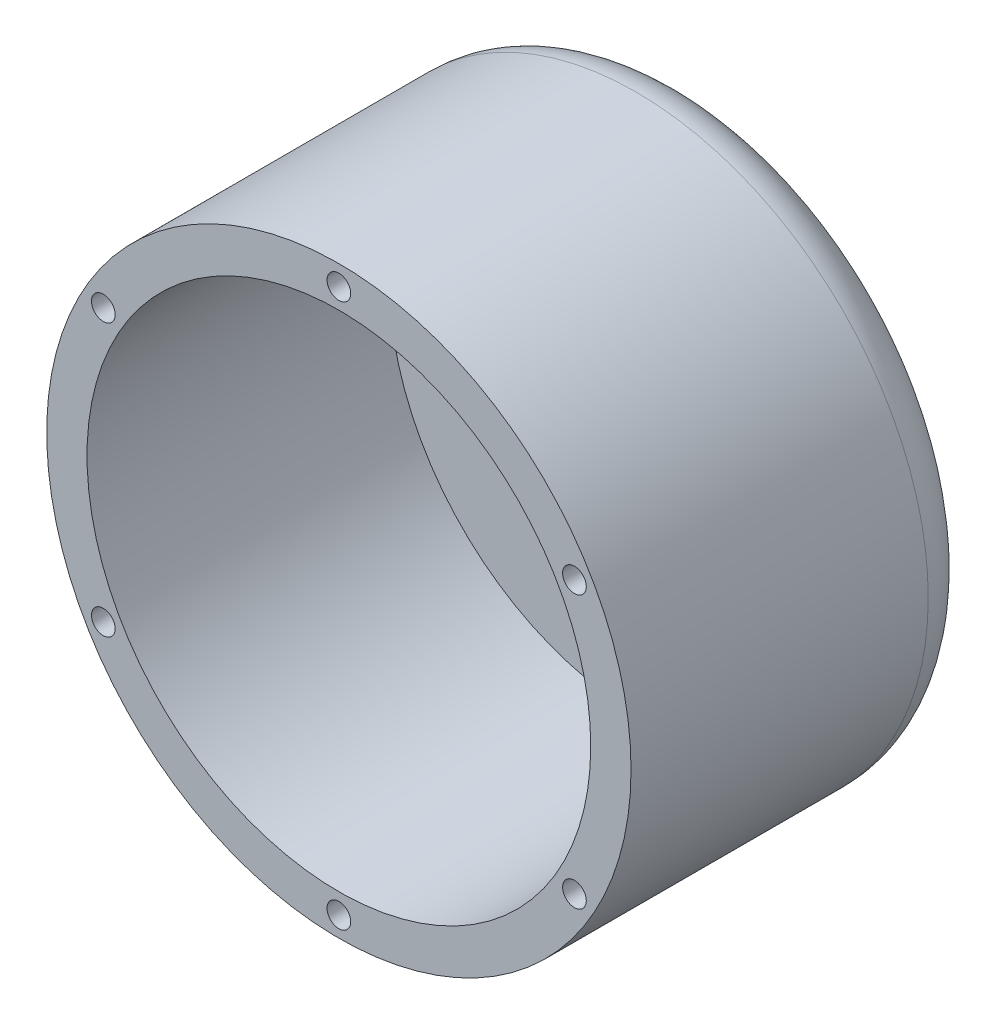
ISO-10303-21;
HEADER;
FILE_DESCRIPTION(('STEP AP214'),'2;1');
FILE_NAME('part.step','',(''),(''),'','','');
FILE_SCHEMA(('AUTOMOTIVE_DESIGN { 1 0 10303 214 1 1 1 1 }'));
ENDSEC;
DATA;
#1=APPLICATION_CONTEXT('core data for automotive mechanical design processes');
#2=APPLICATION_PROTOCOL_DEFINITION('international standard','automotive_design',2000,#1);
#3=PRODUCT_CONTEXT('',#1,'mechanical');
#4=PRODUCT('Part','Part','',(#3));
#5=PRODUCT_RELATED_PRODUCT_CATEGORY('part','',(#4));
#6=PRODUCT_DEFINITION_FORMATION('','',#4);
#7=PRODUCT_DEFINITION_CONTEXT('part definition',#1,'design');
#8=PRODUCT_DEFINITION('design','',#6,#7);
#9=PRODUCT_DEFINITION_SHAPE('','',#8);
#10=(LENGTH_UNIT() NAMED_UNIT(*) SI_UNIT(.MILLI.,.METRE.));
#11=(NAMED_UNIT(*) PLANE_ANGLE_UNIT() SI_UNIT($,.RADIAN.));
#12=(NAMED_UNIT(*) SI_UNIT($,.STERADIAN.) SOLID_ANGLE_UNIT());
#13=UNCERTAINTY_MEASURE_WITH_UNIT(LENGTH_MEASURE(1.E-05),#10,'distance_accuracy_value','');
#14=(GEOMETRIC_REPRESENTATION_CONTEXT(3) GLOBAL_UNCERTAINTY_ASSIGNED_CONTEXT((#13)) GLOBAL_UNIT_ASSIGNED_CONTEXT((#10,
#11,#12)) REPRESENTATION_CONTEXT('',''));
#15=CARTESIAN_POINT('',(0.,0.,0.));
#16=DIRECTION('',(0.,0.,1.));
#17=DIRECTION('',(1.,0.,0.));
#18=AXIS2_PLACEMENT_3D('',#15,#16,#17);
#19=CARTESIAN_POINT('',(0.,0.,-59.9999999999999));
#20=DIRECTION('',(0.,0.,-1.));
#21=DIRECTION('',(-1.,0.,0.));
#22=AXIS2_PLACEMENT_3D('',#19,#20,#21);
#23=PLANE('',#22);
#24=CARTESIAN_POINT('',(-2.05814939933146E-13,0.,-59.9999999999998));
#25=DIRECTION('',(0.,0.,1.));
#26=DIRECTION('',(1.,0.,0.));
#27=AXIS2_PLACEMENT_3D('',#24,#25,#26);
#28=CIRCLE('',#27,50.0000000000002);
#29=CARTESIAN_POINT('',(50.,0.,-60.));
#30=VERTEX_POINT('',#29);
#31=EDGE_CURVE('E167',#30,#30,#28,.T.);
#32=ORIENTED_EDGE('',*,*,#31,.T.);
#33=EDGE_LOOP('',(#32));
#34=FACE_BOUND('',#33,.T.);
#35=CARTESIAN_POINT('',(-15.0000000000002,5.,-59.9999999999999));
#36=DIRECTION('',(0.,0.,-1.));
#37=DIRECTION('',(-1.,0.,0.));
#38=AXIS2_PLACEMENT_3D('',#35,#36,#37);
#39=CIRCLE('',#38,1.5);
#40=CARTESIAN_POINT('',(-16.5000000000002,5.,-59.9999999999999));
#41=VERTEX_POINT('',#40);
#42=EDGE_CURVE('E122',#41,#41,#39,.F.);
#43=ORIENTED_EDGE('',*,*,#42,.F.);
#44=EDGE_LOOP('',(#43));
#45=FACE_BOUND('',#44,.T.);
#46=CARTESIAN_POINT('',(32.9999999999998,5.,-60.));
#47=DIRECTION('',(0.,0.,-1.));
#48=DIRECTION('',(-1.,0.,0.));
#49=AXIS2_PLACEMENT_3D('',#46,#47,#48);
#50=CIRCLE('',#49,1.5);
#51=CARTESIAN_POINT('',(31.4999999999998,5.,-60.));
#52=VERTEX_POINT('',#51);
#53=EDGE_CURVE('E102',#52,#52,#50,.F.);
#54=ORIENTED_EDGE('',*,*,#53,.F.);
#55=EDGE_LOOP('',(#54));
#56=FACE_BOUND('',#55,.T.);
#57=CARTESIAN_POINT('',(32.9999999999998,-5.00000000000001,-60.));
#58=DIRECTION('',(0.,0.,-1.));
#59=DIRECTION('',(-1.,0.,0.));
#60=AXIS2_PLACEMENT_3D('',#57,#58,#59);
#61=CIRCLE('',#60,1.5);
#62=CARTESIAN_POINT('',(31.4999999999998,-5.00000000000001,-60.));
#63=VERTEX_POINT('',#62);
#64=EDGE_CURVE('E114',#63,#63,#61,.F.);
#65=ORIENTED_EDGE('',*,*,#64,.F.);
#66=EDGE_LOOP('',(#65));
#67=FACE_BOUND('',#66,.T.);
#68=CARTESIAN_POINT('',(-15.0000000000002,-5.,-59.9999999999999));
#69=DIRECTION('',(0.,0.,-1.));
#70=DIRECTION('',(-1.,0.,0.));
#71=AXIS2_PLACEMENT_3D('',#68,#69,#70);
#72=CIRCLE('',#71,1.5);
#73=CARTESIAN_POINT('',(-16.5000000000002,-5.,-59.9999999999999));
#74=VERTEX_POINT('',#73);
#75=EDGE_CURVE('E106',#74,#74,#72,.F.);
#76=ORIENTED_EDGE('',*,*,#75,.F.);
#77=EDGE_LOOP('',(#76));
#78=FACE_BOUND('',#77,.T.);
#79=DIRECTION('',(1.,0.,0.));
#80=VECTOR('',#79,1.);
#81=CARTESIAN_POINT('',(29.4999999999998,-10.,-60.));
#82=LINE('',#81,#80);
#83=CARTESIAN_POINT('',(-11.5000000000002,-10.,-60.));
#84=VERTEX_POINT('',#83);
#85=CARTESIAN_POINT('',(29.5,-10.,-60.));
#86=VERTEX_POINT('',#85);
#87=EDGE_CURVE('E88',#84,#86,#82,.T.);
#88=ORIENTED_EDGE('',*,*,#87,.F.);
#89=DIRECTION('',(0.,-1.,0.));
#90=VECTOR('',#89,1.);
#91=CARTESIAN_POINT('',(-11.5000000000002,10.,-59.9999999999999));
#92=LINE('',#91,#90);
#93=CARTESIAN_POINT('',(-11.5000000000002,10.,-59.9999999999999));
#94=VERTEX_POINT('',#93);
#95=EDGE_CURVE('E100',#94,#84,#92,.T.);
#96=ORIENTED_EDGE('',*,*,#95,.F.);
#97=DIRECTION('',(-1.,0.,0.));
#98=VECTOR('',#97,1.);
#99=CARTESIAN_POINT('',(29.4999999999998,10.,-60.));
#100=LINE('',#99,#98);
#101=CARTESIAN_POINT('',(29.4999999999998,10.,-60.));
#102=VERTEX_POINT('',#101);
#103=EDGE_CURVE('E58',#102,#94,#100,.T.);
#104=ORIENTED_EDGE('',*,*,#103,.F.);
#105=DIRECTION('',(0.,1.,0.));
#106=VECTOR('',#105,1.);
#107=CARTESIAN_POINT('',(29.4999999999998,10.,-60.));
#108=LINE('',#107,#106);
#109=EDGE_CURVE('E91',#86,#102,#108,.T.);
#110=ORIENTED_EDGE('',*,*,#109,.F.);
#111=EDGE_LOOP('',(#88,#96,#104,#110));
#112=FACE_BOUND('',#111,.T.);
#113=ADVANCED_FACE('F43',(#34,#45,#56,#67,#78,#112),#23,.F.);
#114=CARTESIAN_POINT('',(3.43024899888577E-12,0.,1000.));
#115=DIRECTION('',(0.,0.,1.));
#116=DIRECTION('',(1.,0.,0.));
#117=AXIS2_PLACEMENT_3D('',#114,#115,#116);
#118=CYLINDRICAL_SURFACE('',#117,50.0000000000001);
#119=ORIENTED_EDGE('',*,*,#31,.F.);
#120=EDGE_LOOP('',(#119));
#121=FACE_BOUND('',#120,.T.);
#122=CARTESIAN_POINT('',(0.,0.,2.22044604925031E-13));
#123=DIRECTION('',(0.,0.,1.));
#124=DIRECTION('',(1.,0.,0.));
#125=AXIS2_PLACEMENT_3D('',#122,#123,#124);
#126=CIRCLE('',#125,50.);
#127=CARTESIAN_POINT('',(50.,0.,0.));
#128=VERTEX_POINT('',#127);
#129=EDGE_CURVE('E164',#128,#128,#126,.T.);
#130=ORIENTED_EDGE('',*,*,#129,.T.);
#131=EDGE_LOOP('',(#130));
#132=FACE_BOUND('',#131,.T.);
#133=ADVANCED_FACE('F187',(#121,#132),#118,.F.);
#134=CARTESIAN_POINT('',(0.,0.,1.78728232904918E-13));
#135=DIRECTION('',(0.,0.,-1.));
#136=DIRECTION('',(-1.,0.,0.));
#137=AXIS2_PLACEMENT_3D('',#134,#135,#136);
#138=PLANE('',#137);
#139=CARTESIAN_POINT('',(0.,54.,0.));
#140=DIRECTION('',(0.,0.,1.));
#141=DIRECTION('',(1.,0.,0.));
#142=AXIS2_PLACEMENT_3D('',#139,#140,#141);
#143=CIRCLE('',#142,2.35);
#144=CARTESIAN_POINT('',(2.35,54.,0.));
#145=VERTEX_POINT('',#144);
#146=EDGE_CURVE('E130',#145,#145,#143,.T.);
#147=ORIENTED_EDGE('',*,*,#146,.F.);
#148=EDGE_LOOP('',(#147));
#149=FACE_BOUND('',#148,.T.);
#150=CARTESIAN_POINT('',(-46.7653718043594,27.0000000000005,0.));
#151=DIRECTION('',(0.,0.,1.));
#152=DIRECTION('',(1.,0.,0.));
#153=AXIS2_PLACEMENT_3D('',#150,#151,#152);
#154=CIRCLE('',#153,2.35);
#155=CARTESIAN_POINT('',(-44.4153718043594,27.0000000000005,0.));
#156=VERTEX_POINT('',#155);
#157=EDGE_CURVE('E134',#156,#156,#154,.T.);
#158=ORIENTED_EDGE('',*,*,#157,.F.);
#159=EDGE_LOOP('',(#158));
#160=FACE_BOUND('',#159,.T.);
#161=CARTESIAN_POINT('',(-46.7653718043599,-26.9999999999996,0.));
#162=DIRECTION('',(0.,0.,1.));
#163=DIRECTION('',(1.,0.,0.));
#164=AXIS2_PLACEMENT_3D('',#161,#162,#163);
#165=CIRCLE('',#164,2.35);
#166=CARTESIAN_POINT('',(-44.4153718043599,-26.9999999999996,0.));
#167=VERTEX_POINT('',#166);
#168=EDGE_CURVE('E157',#167,#167,#165,.T.);
#169=ORIENTED_EDGE('',*,*,#168,.F.);
#170=EDGE_LOOP('',(#169));
#171=FACE_BOUND('',#170,.T.);
#172=CARTESIAN_POINT('',(-3.78189438528707E-13,-54.,0.));
#173=DIRECTION('',(0.,0.,1.));
#174=DIRECTION('',(1.,0.,0.));
#175=AXIS2_PLACEMENT_3D('',#172,#173,#174);
#176=CIRCLE('',#175,2.35);
#177=CARTESIAN_POINT('',(2.34999999999962,-54.,0.));
#178=VERTEX_POINT('',#177);
#179=EDGE_CURVE('E151',#178,#178,#176,.T.);
#180=ORIENTED_EDGE('',*,*,#179,.F.);
#181=EDGE_LOOP('',(#180));
#182=FACE_BOUND('',#181,.T.);
#183=CARTESIAN_POINT('',(46.7653718043596,-27.0000000000002,0.));
#184=DIRECTION('',(0.,0.,1.));
#185=DIRECTION('',(1.,0.,0.));
#186=AXIS2_PLACEMENT_3D('',#183,#184,#185);
#187=CIRCLE('',#186,2.35);
#188=CARTESIAN_POINT('',(49.1153718043596,-27.0000000000002,0.));
#189=VERTEX_POINT('',#188);
#190=EDGE_CURVE('E145',#189,#189,#187,.T.);
#191=ORIENTED_EDGE('',*,*,#190,.F.);
#192=EDGE_LOOP('',(#191));
#193=FACE_BOUND('',#192,.T.);
#194=CARTESIAN_POINT('',(46.7653718043598,26.9999999999999,0.));
#195=DIRECTION('',(0.,0.,1.));
#196=DIRECTION('',(1.,0.,0.));
#197=AXIS2_PLACEMENT_3D('',#194,#195,#196);
#198=CIRCLE('',#197,2.35);
#199=CARTESIAN_POINT('',(49.1153718043598,26.9999999999999,0.));
#200=VERTEX_POINT('',#199);
#201=EDGE_CURVE('E133',#200,#200,#198,.T.);
#202=ORIENTED_EDGE('',*,*,#201,.F.);
#203=EDGE_LOOP('',(#202));
#204=FACE_BOUND('',#203,.T.);
#205=ORIENTED_EDGE('',*,*,#129,.F.);
#206=EDGE_LOOP('',(#205));
#207=FACE_BOUND('',#206,.T.);
#208=CARTESIAN_POINT('',(0.,0.,2.22044604925031E-13));
#209=DIRECTION('',(0.,0.,1.));
#210=DIRECTION('',(1.,0.,0.));
#211=AXIS2_PLACEMENT_3D('',#208,#209,#210);
#212=CIRCLE('',#211,58.);
#213=CARTESIAN_POINT('',(58.,0.,0.));
#214=VERTEX_POINT('',#213);
#215=EDGE_CURVE('E129',#214,#214,#212,.T.);
#216=ORIENTED_EDGE('',*,*,#215,.T.);
#217=EDGE_LOOP('',(#216));
#218=FACE_BOUND('',#217,.T.);
#219=ADVANCED_FACE('F194',(#149,#160,#171,#182,#193,#204,#207,#218),#138,.F.);
#220=CARTESIAN_POINT('',(3.43024899888577E-12,0.,1000.));
#221=DIRECTION('',(0.,0.,1.));
#222=DIRECTION('',(1.,0.,0.));
#223=AXIS2_PLACEMENT_3D('',#220,#221,#222);
#224=CYLINDRICAL_SURFACE('',#223,58.0000000000001);
#225=CARTESIAN_POINT('',(-2.0238469093426E-13,0.,-58.9999999999999));
#226=DIRECTION('',(0.,0.,-1.));
#227=DIRECTION('',(-1.,0.,0.));
#228=AXIS2_PLACEMENT_3D('',#225,#226,#227);
#229=CIRCLE('',#228,58.0000000000001);
#230=CARTESIAN_POINT('',(-58.0000000000003,0.,-58.9999999999997));
#231=VERTEX_POINT('',#230);
#232=EDGE_CURVE('E51',#231,#231,#229,.F.);
#233=ORIENTED_EDGE('',*,*,#232,.T.);
#234=EDGE_LOOP('',(#233));
#235=FACE_BOUND('',#234,.T.);
#236=ORIENTED_EDGE('',*,*,#215,.F.);
#237=EDGE_LOOP('',(#236));
#238=FACE_BOUND('',#237,.T.);
#239=ADVANCED_FACE('F172',(#235,#238),#224,.T.);
#240=CARTESIAN_POINT('',(0.,0.,-68.9999999999999));
#241=DIRECTION('',(0.,0.,-1.));
#242=DIRECTION('',(-1.,0.,0.));
#243=AXIS2_PLACEMENT_3D('',#240,#241,#242);
#244=PLANE('',#243);
#245=CARTESIAN_POINT('',(-2.36687180923118E-13,0.,-68.9999999999999));
#246=DIRECTION('',(0.,0.,-1.));
#247=DIRECTION('',(-1.,0.,0.));
#248=AXIS2_PLACEMENT_3D('',#245,#246,#247);
#249=CIRCLE('',#248,48.0000000000001);
#250=CARTESIAN_POINT('',(-48.0000000000004,0.,-68.9999999999997));
#251=VERTEX_POINT('',#250);
#252=EDGE_CURVE('E11',#251,#251,#249,.T.);
#253=ORIENTED_EDGE('',*,*,#252,.T.);
#254=EDGE_LOOP('',(#253));
#255=FACE_BOUND('',#254,.T.);
#256=CARTESIAN_POINT('',(-15.0000000000002,-5.,-68.9999999999999));
#257=DIRECTION('',(0.,0.,-1.));
#258=DIRECTION('',(1.,0.,0.));
#259=AXIS2_PLACEMENT_3D('',#256,#257,#258);
#260=CIRCLE('',#259,1.5);
#261=CARTESIAN_POINT('',(-16.5000000000002,-5.,-68.9999999999999));
#262=VERTEX_POINT('',#261);
#263=EDGE_CURVE('E109',#262,#262,#260,.T.);
#264=ORIENTED_EDGE('',*,*,#263,.F.);
#265=EDGE_LOOP('',(#264));
#266=FACE_BOUND('',#265,.T.);
#267=CARTESIAN_POINT('',(32.9999999999998,-5.00000000000001,-69.));
#268=DIRECTION('',(0.,0.,-1.));
#269=DIRECTION('',(-1.,0.,0.));
#270=AXIS2_PLACEMENT_3D('',#267,#268,#269);
#271=CIRCLE('',#270,1.5);
#272=CARTESIAN_POINT('',(31.4999999999998,-5.00000000000001,-69.));
#273=VERTEX_POINT('',#272);
#274=EDGE_CURVE('E110',#273,#273,#271,.T.);
#275=ORIENTED_EDGE('',*,*,#274,.F.);
#276=EDGE_LOOP('',(#275));
#277=FACE_BOUND('',#276,.T.);
#278=CARTESIAN_POINT('',(32.9999999999998,5.,-69.));
#279=DIRECTION('',(0.,0.,-1.));
#280=DIRECTION('',(1.,0.,0.));
#281=AXIS2_PLACEMENT_3D('',#278,#279,#280);
#282=CIRCLE('',#281,1.5);
#283=CARTESIAN_POINT('',(31.4999999999998,5.,-69.));
#284=VERTEX_POINT('',#283);
#285=EDGE_CURVE('E117',#284,#284,#282,.T.);
#286=ORIENTED_EDGE('',*,*,#285,.F.);
#287=EDGE_LOOP('',(#286));
#288=FACE_BOUND('',#287,.T.);
#289=DIRECTION('',(0.,-1.,0.));
#290=VECTOR('',#289,1.);
#291=CARTESIAN_POINT('',(29.4999999999998,10.,-69.));
#292=LINE('',#291,#290);
#293=CARTESIAN_POINT('',(29.4999999999998,10.,-69.));
#294=VERTEX_POINT('',#293);
#295=CARTESIAN_POINT('',(29.4999999999998,-10.,-69.));
#296=VERTEX_POINT('',#295);
#297=EDGE_CURVE('E66',#294,#296,#292,.T.);
#298=ORIENTED_EDGE('',*,*,#297,.F.);
#299=DIRECTION('',(1.,0.,0.));
#300=VECTOR('',#299,1.);
#301=CARTESIAN_POINT('',(29.4999999999998,10.,-69.));
#302=LINE('',#301,#300);
#303=CARTESIAN_POINT('',(-11.5000000000002,10.,-68.9999999999999));
#304=VERTEX_POINT('',#303);
#305=EDGE_CURVE('E86',#304,#294,#302,.T.);
#306=ORIENTED_EDGE('',*,*,#305,.F.);
#307=DIRECTION('',(0.,1.,0.));
#308=VECTOR('',#307,1.);
#309=CARTESIAN_POINT('',(-11.5000000000002,10.,-68.9999999999999));
#310=LINE('',#309,#308);
#311=CARTESIAN_POINT('',(-11.5000000000002,-10.,-68.9999999999999));
#312=VERTEX_POINT('',#311);
#313=EDGE_CURVE('E292',#312,#304,#310,.T.);
#314=ORIENTED_EDGE('',*,*,#313,.F.);
#315=DIRECTION('',(-1.,0.,0.));
#316=VECTOR('',#315,1.);
#317=CARTESIAN_POINT('',(29.4999999999998,-10.,-69.));
#318=LINE('',#317,#316);
#319=EDGE_CURVE('E295',#296,#312,#318,.T.);
#320=ORIENTED_EDGE('',*,*,#319,.F.);
#321=EDGE_LOOP('',(#298,#306,#314,#320));
#322=FACE_BOUND('',#321,.T.);
#323=CARTESIAN_POINT('',(-15.0000000000002,5.,-68.9999999999999));
#324=DIRECTION('',(0.,0.,-1.));
#325=DIRECTION('',(-1.,0.,0.));
#326=AXIS2_PLACEMENT_3D('',#323,#324,#325);
#327=CIRCLE('',#326,1.5);
#328=CARTESIAN_POINT('',(-16.5000000000002,5.,-68.9999999999999));
#329=VERTEX_POINT('',#328);
#330=EDGE_CURVE('E113',#329,#329,#327,.T.);
#331=ORIENTED_EDGE('',*,*,#330,.F.);
#332=EDGE_LOOP('',(#331));
#333=FACE_BOUND('',#332,.T.);
#334=ADVANCED_FACE('F204',(#255,#266,#277,#288,#322,#333),#244,.T.);
#335=CARTESIAN_POINT('',(46.7653718043598,26.9999999999999,-6.));
#336=DIRECTION('',(0.,0.,1.));
#337=DIRECTION('',(1.,0.,0.));
#338=AXIS2_PLACEMENT_3D('',#335,#336,#337);
#339=CYLINDRICAL_SURFACE('',#338,2.35);
#340=CARTESIAN_POINT('',(46.7653718043598,26.9999999999999,-6.));
#341=DIRECTION('',(0.,0.,1.));
#342=DIRECTION('',(1.,0.,0.));
#343=AXIS2_PLACEMENT_3D('',#340,#341,#342);
#344=CIRCLE('',#343,2.35);
#345=CARTESIAN_POINT('',(49.1153718043598,26.9999999999999,-6.));
#346=VERTEX_POINT('',#345);
#347=EDGE_CURVE('E142',#346,#346,#344,.T.);
#348=ORIENTED_EDGE('',*,*,#347,.F.);
#349=EDGE_LOOP('',(#348));
#350=FACE_BOUND('',#349,.T.);
#351=ORIENTED_EDGE('',*,*,#201,.T.);
#352=EDGE_LOOP('',(#351));
#353=FACE_BOUND('',#352,.T.);
#354=ADVANCED_FACE('F206',(#350,#353),#339,.F.);
#355=CARTESIAN_POINT('',(46.7653718043598,26.9999999999999,-6.));
#356=DIRECTION('',(0.,0.,1.));
#357=DIRECTION('',(1.,0.,0.));
#358=AXIS2_PLACEMENT_3D('',#355,#356,#357);
#359=PLANE('',#358);
#360=ORIENTED_EDGE('',*,*,#347,.T.);
#361=EDGE_LOOP('',(#360));
#362=FACE_BOUND('',#361,.T.);
#363=ADVANCED_FACE('F232',(#362),#359,.T.);
#364=CARTESIAN_POINT('',(46.7653718043596,-27.0000000000002,-6.));
#365=DIRECTION('',(0.,0.,1.));
#366=DIRECTION('',(1.,0.,0.));
#367=AXIS2_PLACEMENT_3D('',#364,#365,#366);
#368=CYLINDRICAL_SURFACE('',#367,2.35);
#369=CARTESIAN_POINT('',(46.7653718043596,-27.0000000000002,-6.));
#370=DIRECTION('',(0.,0.,1.));
#371=DIRECTION('',(1.,0.,0.));
#372=AXIS2_PLACEMENT_3D('',#369,#370,#371);
#373=CIRCLE('',#372,2.35);
#374=CARTESIAN_POINT('',(49.1153718043596,-27.0000000000002,-6.));
#375=VERTEX_POINT('',#374);
#376=EDGE_CURVE('E148',#375,#375,#373,.T.);
#377=ORIENTED_EDGE('',*,*,#376,.F.);
#378=EDGE_LOOP('',(#377));
#379=FACE_BOUND('',#378,.T.);
#380=ORIENTED_EDGE('',*,*,#190,.T.);
#381=EDGE_LOOP('',(#380));
#382=FACE_BOUND('',#381,.T.);
#383=ADVANCED_FACE('F228',(#379,#382),#368,.F.);
#384=CARTESIAN_POINT('',(46.7653718043596,-27.0000000000002,-6.));
#385=DIRECTION('',(0.,0.,1.));
#386=DIRECTION('',(1.,0.,0.));
#387=AXIS2_PLACEMENT_3D('',#384,#385,#386);
#388=PLANE('',#387);
#389=ORIENTED_EDGE('',*,*,#376,.T.);
#390=EDGE_LOOP('',(#389));
#391=FACE_BOUND('',#390,.T.);
#392=ADVANCED_FACE('F224',(#391),#388,.T.);
#393=CARTESIAN_POINT('',(-3.78189438528707E-13,-54.,-6.));
#394=DIRECTION('',(0.,0.,1.));
#395=DIRECTION('',(1.,0.,0.));
#396=AXIS2_PLACEMENT_3D('',#393,#394,#395);
#397=CYLINDRICAL_SURFACE('',#396,2.35);
#398=CARTESIAN_POINT('',(-3.78189438528707E-13,-54.,-6.));
#399=DIRECTION('',(0.,0.,1.));
#400=DIRECTION('',(1.,0.,0.));
#401=AXIS2_PLACEMENT_3D('',#398,#399,#400);
#402=CIRCLE('',#401,2.35);
#403=CARTESIAN_POINT('',(2.34999999999962,-54.,-6.));
#404=VERTEX_POINT('',#403);
#405=EDGE_CURVE('E154',#404,#404,#402,.T.);
#406=ORIENTED_EDGE('',*,*,#405,.F.);
#407=EDGE_LOOP('',(#406));
#408=FACE_BOUND('',#407,.T.);
#409=ORIENTED_EDGE('',*,*,#179,.T.);
#410=EDGE_LOOP('',(#409));
#411=FACE_BOUND('',#410,.T.);
#412=ADVANCED_FACE('F220',(#408,#411),#397,.F.);
#413=CARTESIAN_POINT('',(-3.78189438528707E-13,-54.,-6.));
#414=DIRECTION('',(0.,0.,1.));
#415=DIRECTION('',(1.,0.,0.));
#416=AXIS2_PLACEMENT_3D('',#413,#414,#415);
#417=PLANE('',#416);
#418=ORIENTED_EDGE('',*,*,#405,.T.);
#419=EDGE_LOOP('',(#418));
#420=FACE_BOUND('',#419,.T.);
#421=ADVANCED_FACE('F216',(#420),#417,.T.);
#422=CARTESIAN_POINT('',(-46.7653718043599,-26.9999999999996,-6.));
#423=DIRECTION('',(0.,0.,1.));
#424=DIRECTION('',(1.,0.,0.));
#425=AXIS2_PLACEMENT_3D('',#422,#423,#424);
#426=CYLINDRICAL_SURFACE('',#425,2.35);
#427=CARTESIAN_POINT('',(-46.7653718043599,-26.9999999999996,-6.));
#428=DIRECTION('',(0.,0.,1.));
#429=DIRECTION('',(1.,0.,0.));
#430=AXIS2_PLACEMENT_3D('',#427,#428,#429);
#431=CIRCLE('',#430,2.35);
#432=CARTESIAN_POINT('',(-44.4153718043599,-26.9999999999996,-6.));
#433=VERTEX_POINT('',#432);
#434=EDGE_CURVE('E137',#433,#433,#431,.T.);
#435=ORIENTED_EDGE('',*,*,#434,.F.);
#436=EDGE_LOOP('',(#435));
#437=FACE_BOUND('',#436,.T.);
#438=ORIENTED_EDGE('',*,*,#168,.T.);
#439=EDGE_LOOP('',(#438));
#440=FACE_BOUND('',#439,.T.);
#441=ADVANCED_FACE('F212',(#437,#440),#426,.F.);
#442=CARTESIAN_POINT('',(-46.7653718043599,-26.9999999999996,-6.));
#443=DIRECTION('',(0.,0.,1.));
#444=DIRECTION('',(1.,0.,0.));
#445=AXIS2_PLACEMENT_3D('',#442,#443,#444);
#446=PLANE('',#445);
#447=ORIENTED_EDGE('',*,*,#434,.T.);
#448=EDGE_LOOP('',(#447));
#449=FACE_BOUND('',#448,.T.);
#450=ADVANCED_FACE('F208',(#449),#446,.T.);
#451=CARTESIAN_POINT('',(-46.7653718043594,27.0000000000005,-6.));
#452=DIRECTION('',(0.,0.,1.));
#453=DIRECTION('',(1.,0.,0.));
#454=AXIS2_PLACEMENT_3D('',#451,#452,#453);
#455=CYLINDRICAL_SURFACE('',#454,2.35);
#456=CARTESIAN_POINT('',(-46.7653718043594,27.0000000000005,-6.));
#457=DIRECTION('',(0.,0.,1.));
#458=DIRECTION('',(1.,0.,0.));
#459=AXIS2_PLACEMENT_3D('',#456,#457,#458);
#460=CIRCLE('',#459,2.35);
#461=CARTESIAN_POINT('',(-44.4153718043594,27.0000000000005,-6.));
#462=VERTEX_POINT('',#461);
#463=EDGE_CURVE('E125',#462,#462,#460,.T.);
#464=ORIENTED_EDGE('',*,*,#463,.F.);
#465=EDGE_LOOP('',(#464));
#466=FACE_BOUND('',#465,.T.);
#467=ORIENTED_EDGE('',*,*,#157,.T.);
#468=EDGE_LOOP('',(#467));
#469=FACE_BOUND('',#468,.T.);
#470=ADVANCED_FACE('F211',(#466,#469),#455,.F.);
#471=CARTESIAN_POINT('',(-46.7653718043594,27.0000000000005,-6.));
#472=DIRECTION('',(0.,0.,1.));
#473=DIRECTION('',(1.,0.,0.));
#474=AXIS2_PLACEMENT_3D('',#471,#472,#473);
#475=PLANE('',#474);
#476=ORIENTED_EDGE('',*,*,#463,.T.);
#477=EDGE_LOOP('',(#476));
#478=FACE_BOUND('',#477,.T.);
#479=ADVANCED_FACE('F240',(#478),#475,.T.);
#480=CARTESIAN_POINT('',(0.,54.,-6.));
#481=DIRECTION('',(0.,0.,1.));
#482=DIRECTION('',(1.,0.,0.));
#483=AXIS2_PLACEMENT_3D('',#480,#481,#482);
#484=CYLINDRICAL_SURFACE('',#483,2.35);
#485=CARTESIAN_POINT('',(0.,54.,-6.));
#486=DIRECTION('',(0.,0.,1.));
#487=DIRECTION('',(1.,0.,0.));
#488=AXIS2_PLACEMENT_3D('',#485,#486,#487);
#489=CIRCLE('',#488,2.35);
#490=CARTESIAN_POINT('',(2.35,54.,-6.));
#491=VERTEX_POINT('',#490);
#492=EDGE_CURVE('E126',#491,#491,#489,.T.);
#493=ORIENTED_EDGE('',*,*,#492,.F.);
#494=EDGE_LOOP('',(#493));
#495=FACE_BOUND('',#494,.T.);
#496=ORIENTED_EDGE('',*,*,#146,.T.);
#497=EDGE_LOOP('',(#496));
#498=FACE_BOUND('',#497,.T.);
#499=ADVANCED_FACE('F243',(#495,#498),#484,.F.);
#500=CARTESIAN_POINT('',(0.,54.,-6.));
#501=DIRECTION('',(0.,0.,1.));
#502=DIRECTION('',(1.,0.,0.));
#503=AXIS2_PLACEMENT_3D('',#500,#501,#502);
#504=PLANE('',#503);
#505=ORIENTED_EDGE('',*,*,#492,.T.);
#506=EDGE_LOOP('',(#505));
#507=FACE_BOUND('',#506,.T.);
#508=ADVANCED_FACE('F250',(#507),#504,.T.);
#509=CARTESIAN_POINT('',(-15.,5.,0.00100000000030631));
#510=DIRECTION('',(0.,0.,-1.));
#511=DIRECTION('',(-1.,0.,0.));
#512=AXIS2_PLACEMENT_3D('',#509,#510,#511);
#513=CYLINDRICAL_SURFACE('',#512,1.5);
#514=CARTESIAN_POINT('',(-16.5000000000002,5.,-68.9999999999999));
#515=CARTESIAN_POINT('',(-16.5000000000002,5.,-68.9062499999998));
#516=CARTESIAN_POINT('',(-16.5000000000002,5.,-68.8124999999999));
#517=CARTESIAN_POINT('',(-16.5000000000002,5.,-68.6249999999999));
#518=CARTESIAN_POINT('',(-16.5000000000002,5.,-68.5312499999999));
#519=CARTESIAN_POINT('',(-16.5000000000002,5.,-68.3437499999999));
#520=CARTESIAN_POINT('',(-16.5000000000002,5.,-68.2499999999999));
#521=CARTESIAN_POINT('',(-16.5000000000002,5.,-68.0624999999998));
#522=CARTESIAN_POINT('',(-16.5000000000002,5.,-67.9687499999999));
#523=CARTESIAN_POINT('',(-16.5000000000002,5.,-67.7812499999998));
#524=CARTESIAN_POINT('',(-16.5000000000002,5.,-67.6874999999999));
#525=CARTESIAN_POINT('',(-16.5000000000002,5.,-67.4999999999999));
#526=CARTESIAN_POINT('',(-16.5000000000002,5.,-67.4062499999999));
#527=CARTESIAN_POINT('',(-16.5000000000002,5.,-67.2187499999999));
#528=CARTESIAN_POINT('',(-16.5000000000002,5.,-67.1249999999999));
#529=CARTESIAN_POINT('',(-16.5000000000002,5.,-66.9374999999999));
#530=CARTESIAN_POINT('',(-16.5000000000002,5.,-66.8437499999999));
#531=CARTESIAN_POINT('',(-16.5000000000002,5.,-66.6562499999998));
#532=CARTESIAN_POINT('',(-16.5000000000002,5.,-66.5624999999999));
#533=CARTESIAN_POINT('',(-16.5000000000002,5.,-66.3749999999999));
#534=CARTESIAN_POINT('',(-16.5000000000002,5.,-66.2812499999999));
#535=CARTESIAN_POINT('',(-16.5000000000002,5.,-66.0937499999999));
#536=CARTESIAN_POINT('',(-16.5000000000002,5.,-65.9999999999999));
#537=CARTESIAN_POINT('',(-16.5000000000002,5.,-65.8124999999999));
#538=CARTESIAN_POINT('',(-16.5000000000002,5.,-65.7187499999999));
#539=CARTESIAN_POINT('',(-16.5000000000002,5.,-65.5312499999999));
#540=CARTESIAN_POINT('',(-16.5000000000002,5.,-65.4374999999999));
#541=CARTESIAN_POINT('',(-16.5000000000002,5.,-65.2499999999999));
#542=CARTESIAN_POINT('',(-16.5000000000002,5.,-65.1562499999999));
#543=CARTESIAN_POINT('',(-16.5000000000002,5.,-64.9687499999999));
#544=CARTESIAN_POINT('',(-16.5000000000002,5.,-64.8749999999999));
#545=CARTESIAN_POINT('',(-16.5000000000002,5.,-64.6874999999999));
#546=CARTESIAN_POINT('',(-16.5000000000002,5.,-64.5937499999999));
#547=CARTESIAN_POINT('',(-16.5000000000002,5.,-64.4062499999999));
#548=CARTESIAN_POINT('',(-16.5000000000002,5.,-64.3124999999999));
#549=CARTESIAN_POINT('',(-16.5000000000002,5.,-64.1249999999999));
#550=CARTESIAN_POINT('',(-16.5000000000002,5.,-64.0312499999999));
#551=CARTESIAN_POINT('',(-16.5000000000002,5.,-63.8437499999999));
#552=CARTESIAN_POINT('',(-16.5000000000002,5.,-63.7499999999999));
#553=CARTESIAN_POINT('',(-16.5000000000002,5.,-63.5624999999999));
#554=CARTESIAN_POINT('',(-16.5000000000002,5.,-63.4687499999999));
#555=CARTESIAN_POINT('',(-16.5000000000002,5.,-63.2812499999999));
#556=CARTESIAN_POINT('',(-16.5000000000002,5.,-63.1874999999999));
#557=CARTESIAN_POINT('',(-16.5000000000002,5.,-62.9999999999999));
#558=CARTESIAN_POINT('',(-16.5000000000002,5.,-62.9062499999999));
#559=CARTESIAN_POINT('',(-16.5000000000002,5.,-62.7187499999999));
#560=CARTESIAN_POINT('',(-16.5000000000002,5.,-62.6249999999999));
#561=CARTESIAN_POINT('',(-16.5000000000002,5.,-62.4374999999999));
#562=CARTESIAN_POINT('',(-16.5000000000002,5.,-62.3437499999999));
#563=CARTESIAN_POINT('',(-16.5000000000002,5.,-62.1562499999999));
#564=CARTESIAN_POINT('',(-16.5000000000002,5.,-62.0624999999999));
#565=CARTESIAN_POINT('',(-16.5000000000002,5.,-61.8749999999999));
#566=CARTESIAN_POINT('',(-16.5000000000002,5.,-61.7812499999999));
#567=CARTESIAN_POINT('',(-16.5000000000002,5.,-61.5937499999999));
#568=CARTESIAN_POINT('',(-16.5000000000002,5.,-61.4999999999999));
#569=CARTESIAN_POINT('',(-16.5000000000002,5.,-61.3124999999999));
#570=CARTESIAN_POINT('',(-16.5000000000002,5.,-61.2187499999999));
#571=CARTESIAN_POINT('',(-16.5000000000002,5.,-61.0312499999999));
#572=CARTESIAN_POINT('',(-16.5000000000002,5.,-60.9374999999999));
#573=CARTESIAN_POINT('',(-16.5000000000002,5.,-60.7499999999999));
#574=CARTESIAN_POINT('',(-16.5000000000002,5.,-60.6562499999999));
#575=CARTESIAN_POINT('',(-16.5000000000002,5.,-60.4687499999999));
#576=CARTESIAN_POINT('',(-16.5000000000002,5.,-60.3749999999999));
#577=CARTESIAN_POINT('',(-16.5000000000002,5.,-60.1874999999999));
#578=CARTESIAN_POINT('',(-16.5000000000002,5.,-60.0937499999999));
#579=CARTESIAN_POINT('',(-16.5000000000002,5.,-59.9999999999999));
#580=B_SPLINE_CURVE_WITH_KNOTS('',3,(#514,#515,#516,#517,#518,#519,#520,#521,#522,#523,#524,
#525,#526,#527,#528,#529,#530,#531,#532,#533,#534,#535,#536,#537,#538,#539,#540,#541,#542,#543,
#544,#545,#546,#547,#548,#549,#550,#551,#552,#553,#554,#555,#556,#557,#558,#559,#560,#561,#562,
#563,#564,#565,#566,#567,#568,#569,#570,#571,#572,#573,#574,#575,#576,#577,#578,#579),
.UNSPECIFIED.,.F.,.F.,(4,2,2,2,2,2,2,2,2,2,2,2,2,2,2,2,2,2,2,2,2,2,2,2,2,2,2,2,2,2,2,2,4),(0.,
0.281249999999997,0.562499999999994,0.843750000000004,1.125,1.40625,1.68749999999999,
1.96874999999999,2.25,2.53125,2.8125,3.09374999999999,3.37499999999999,3.65624999999999,3.9375,
4.21874999999999,4.49999999999999,4.78124999999999,5.06249999999998,5.34374999999999,
5.62499999999999,5.90624999999999,6.18749999999998,6.46874999999998,6.74999999999998,
7.03124999999998,7.31249999999999,7.59374999999998,7.87499999999998,8.15624999999998,
8.43749999999998,8.71874999999998,8.99999999999998),.UNSPECIFIED.);
#581=EDGE_CURVE('BSEAM253',#329,#41,#580,.T.);
#582=ORIENTED_EDGE('',*,*,#330,.T.);
#583=ORIENTED_EDGE('',*,*,#42,.T.);
#584=ORIENTED_EDGE('',*,*,#581,.T.);
#585=ORIENTED_EDGE('',*,*,#581,.F.);
#586=EDGE_LOOP('',(#582,#584,#583,#585));
#587=FACE_BOUND('',#586,.T.);
#588=ADVANCED_FACE('F253',(#587),#513,.F.);
#589=CARTESIAN_POINT('',(29.5,10.,0.00100000000015366));
#590=DIRECTION('',(1.,0.,0.));
#591=DIRECTION('',(0.,0.,-1.));
#592=AXIS2_PLACEMENT_3D('',#589,#590,#591);
#593=PLANE('',#592);
#594=ORIENTED_EDGE('',*,*,#109,.T.);
#595=DIRECTION('',(0.,0.,-1.));
#596=VECTOR('',#595,1.);
#597=CARTESIAN_POINT('',(29.5,10.,0.00100000000015366));
#598=LINE('',#597,#596);
#599=EDGE_CURVE('E82',#102,#294,#598,.T.);
#600=ORIENTED_EDGE('',*,*,#599,.T.);
#601=ORIENTED_EDGE('',*,*,#297,.T.);
#602=DIRECTION('',(0.,0.,-1.));
#603=VECTOR('',#602,1.);
#604=CARTESIAN_POINT('',(29.5,-10.,0.00100000000015366));
#605=LINE('',#604,#603);
#606=EDGE_CURVE('E93',#86,#296,#605,.T.);
#607=ORIENTED_EDGE('',*,*,#606,.F.);
#608=EDGE_LOOP('',(#594,#600,#601,#607));
#609=FACE_BOUND('',#608,.T.);
#610=ADVANCED_FACE('F92',(#609),#593,.F.);
#611=CARTESIAN_POINT('',(29.5,10.,0.00100000000015366));
#612=DIRECTION('',(0.,1.,0.));
#613=DIRECTION('',(0.,0.,1.));
#614=AXIS2_PLACEMENT_3D('',#611,#612,#613);
#615=PLANE('',#614);
#616=ORIENTED_EDGE('',*,*,#103,.T.);
#617=DIRECTION('',(0.,0.,-1.));
#618=VECTOR('',#617,1.);
#619=CARTESIAN_POINT('',(-11.5,10.,0.00100000000029243));
#620=LINE('',#619,#618);
#621=EDGE_CURVE('E87',#94,#304,#620,.T.);
#622=ORIENTED_EDGE('',*,*,#621,.T.);
#623=ORIENTED_EDGE('',*,*,#305,.T.);
#624=ORIENTED_EDGE('',*,*,#599,.F.);
#625=EDGE_LOOP('',(#616,#622,#623,#624));
#626=FACE_BOUND('',#625,.T.);
#627=ADVANCED_FACE('F84',(#626),#615,.F.);
#628=CARTESIAN_POINT('',(-11.5,10.,0.00100000000029243));
#629=DIRECTION('',(-1.,0.,0.));
#630=DIRECTION('',(0.,0.,1.));
#631=AXIS2_PLACEMENT_3D('',#628,#629,#630);
#632=PLANE('',#631);
#633=ORIENTED_EDGE('',*,*,#95,.T.);
#634=DIRECTION('',(0.,0.,-1.));
#635=VECTOR('',#634,1.);
#636=CARTESIAN_POINT('',(-11.5,-10.,0.00100000000029243));
#637=LINE('',#636,#635);
#638=EDGE_CURVE('E288',#84,#312,#637,.T.);
#639=ORIENTED_EDGE('',*,*,#638,.T.);
#640=ORIENTED_EDGE('',*,*,#313,.T.);
#641=ORIENTED_EDGE('',*,*,#621,.F.);
#642=EDGE_LOOP('',(#633,#639,#640,#641));
#643=FACE_BOUND('',#642,.T.);
#644=ADVANCED_FACE('F263',(#643),#632,.F.);
#645=CARTESIAN_POINT('',(29.5,-10.,0.00100000000015366));
#646=DIRECTION('',(0.,-1.,0.));
#647=DIRECTION('',(0.,0.,-1.));
#648=AXIS2_PLACEMENT_3D('',#645,#646,#647);
#649=PLANE('',#648);
#650=ORIENTED_EDGE('',*,*,#87,.T.);
#651=ORIENTED_EDGE('',*,*,#606,.T.);
#652=ORIENTED_EDGE('',*,*,#319,.T.);
#653=ORIENTED_EDGE('',*,*,#638,.F.);
#654=EDGE_LOOP('',(#650,#651,#652,#653));
#655=FACE_BOUND('',#654,.T.);
#656=ADVANCED_FACE('F266',(#655),#649,.F.);
#657=CARTESIAN_POINT('',(33.,5.,0.00100000000013978));
#658=DIRECTION('',(0.,0.,-1.));
#659=DIRECTION('',(-1.,0.,0.));
#660=AXIS2_PLACEMENT_3D('',#657,#658,#659);
#661=CYLINDRICAL_SURFACE('',#660,1.5);
#662=CARTESIAN_POINT('',(31.4999999999998,5.,-69.));
#663=CARTESIAN_POINT('',(31.4999999999998,5.,-68.90625));
#664=CARTESIAN_POINT('',(31.4999999999998,5.,-68.8125));
#665=CARTESIAN_POINT('',(31.4999999999998,5.,-68.625));
#666=CARTESIAN_POINT('',(31.4999999999998,5.,-68.53125));
#667=CARTESIAN_POINT('',(31.4999999999998,5.,-68.34375));
#668=CARTESIAN_POINT('',(31.4999999999998,5.,-68.25));
#669=CARTESIAN_POINT('',(31.4999999999998,5.,-68.0625));
#670=CARTESIAN_POINT('',(31.4999999999998,5.,-67.96875));
#671=CARTESIAN_POINT('',(31.4999999999998,5.,-67.78125));
#672=CARTESIAN_POINT('',(31.4999999999998,5.,-67.6875));
#673=CARTESIAN_POINT('',(31.4999999999998,5.,-67.5));
#674=CARTESIAN_POINT('',(31.4999999999998,5.,-67.40625));
#675=CARTESIAN_POINT('',(31.4999999999998,5.,-67.21875));
#676=CARTESIAN_POINT('',(31.4999999999998,5.,-67.125));
#677=CARTESIAN_POINT('',(31.4999999999998,5.,-66.9375));
#678=CARTESIAN_POINT('',(31.4999999999998,5.,-66.84375));
#679=CARTESIAN_POINT('',(31.4999999999998,5.,-66.65625));
#680=CARTESIAN_POINT('',(31.4999999999998,5.,-66.5625));
#681=CARTESIAN_POINT('',(31.4999999999998,5.,-66.375));
#682=CARTESIAN_POINT('',(31.4999999999998,5.,-66.28125));
#683=CARTESIAN_POINT('',(31.4999999999998,5.,-66.09375));
#684=CARTESIAN_POINT('',(31.4999999999998,5.,-66.));
#685=CARTESIAN_POINT('',(31.4999999999998,5.,-65.8125));
#686=CARTESIAN_POINT('',(31.4999999999998,5.,-65.71875));
#687=CARTESIAN_POINT('',(31.4999999999998,5.,-65.53125));
#688=CARTESIAN_POINT('',(31.4999999999998,5.,-65.4375));
#689=CARTESIAN_POINT('',(31.4999999999998,5.,-65.25));
#690=CARTESIAN_POINT('',(31.4999999999998,5.,-65.15625));
#691=CARTESIAN_POINT('',(31.4999999999998,5.,-64.96875));
#692=CARTESIAN_POINT('',(31.4999999999998,5.,-64.875));
#693=CARTESIAN_POINT('',(31.4999999999998,5.,-64.6875));
#694=CARTESIAN_POINT('',(31.4999999999998,5.,-64.59375));
#695=CARTESIAN_POINT('',(31.4999999999998,5.,-64.40625));
#696=CARTESIAN_POINT('',(31.4999999999998,5.,-64.3125));
#697=CARTESIAN_POINT('',(31.4999999999998,5.,-64.125));
#698=CARTESIAN_POINT('',(31.4999999999998,5.,-64.03125));
#699=CARTESIAN_POINT('',(31.4999999999998,5.,-63.84375));
#700=CARTESIAN_POINT('',(31.4999999999998,5.,-63.75));
#701=CARTESIAN_POINT('',(31.4999999999998,5.,-63.5625));
#702=CARTESIAN_POINT('',(31.4999999999998,5.,-63.46875));
#703=CARTESIAN_POINT('',(31.4999999999998,5.,-63.28125));
#704=CARTESIAN_POINT('',(31.4999999999998,5.,-63.1875));
#705=CARTESIAN_POINT('',(31.4999999999998,5.,-63.));
#706=CARTESIAN_POINT('',(31.4999999999998,5.,-62.90625));
#707=CARTESIAN_POINT('',(31.4999999999998,5.,-62.71875));
#708=CARTESIAN_POINT('',(31.4999999999998,5.,-62.625));
#709=CARTESIAN_POINT('',(31.4999999999998,5.,-62.4375));
#710=CARTESIAN_POINT('',(31.4999999999998,5.,-62.34375));
#711=CARTESIAN_POINT('',(31.4999999999998,5.,-62.15625));
#712=CARTESIAN_POINT('',(31.4999999999998,5.,-62.0625));
#713=CARTESIAN_POINT('',(31.4999999999998,5.,-61.875));
#714=CARTESIAN_POINT('',(31.4999999999998,5.,-61.78125));
#715=CARTESIAN_POINT('',(31.4999999999998,5.,-61.59375));
#716=CARTESIAN_POINT('',(31.4999999999998,5.,-61.5));
#717=CARTESIAN_POINT('',(31.4999999999998,5.,-61.3125));
#718=CARTESIAN_POINT('',(31.4999999999998,5.,-61.21875));
#719=CARTESIAN_POINT('',(31.4999999999998,5.,-61.03125));
#720=CARTESIAN_POINT('',(31.4999999999998,5.,-60.9375));
#721=CARTESIAN_POINT('',(31.4999999999998,5.,-60.75));
#722=CARTESIAN_POINT('',(31.4999999999998,5.,-60.65625));
#723=CARTESIAN_POINT('',(31.4999999999998,5.,-60.46875));
#724=CARTESIAN_POINT('',(31.4999999999998,5.,-60.375));
#725=CARTESIAN_POINT('',(31.4999999999998,5.,-60.1875));
#726=CARTESIAN_POINT('',(31.4999999999998,5.,-60.09375));
#727=CARTESIAN_POINT('',(31.4999999999998,5.,-60.));
#728=B_SPLINE_CURVE_WITH_KNOTS('',3,(#662,#663,#664,#665,#666,#667,#668,#669,#670,#671,#672,
#673,#674,#675,#676,#677,#678,#679,#680,#681,#682,#683,#684,#685,#686,#687,#688,#689,#690,#691,
#692,#693,#694,#695,#696,#697,#698,#699,#700,#701,#702,#703,#704,#705,#706,#707,#708,#709,#710,
#711,#712,#713,#714,#715,#716,#717,#718,#719,#720,#721,#722,#723,#724,#725,#726,#727),
.UNSPECIFIED.,.F.,.F.,(4,2,2,2,2,2,2,2,2,2,2,2,2,2,2,2,2,2,2,2,2,2,2,2,2,2,2,2,2,2,2,2,4),(0.,
0.281249999999997,0.562499999999994,0.843750000000004,1.125,1.40625,1.68749999999999,
1.96874999999999,2.25,2.53125,2.8125,3.09374999999999,3.37499999999999,3.65624999999999,3.9375,
4.21874999999999,4.49999999999999,4.78124999999999,5.06249999999998,5.34374999999999,
5.62499999999999,5.90624999999999,6.18749999999998,6.46874999999998,6.74999999999998,
7.03124999999998,7.31249999999999,7.59374999999998,7.87499999999998,8.15624999999998,
8.43749999999998,8.71874999999998,8.99999999999998),.UNSPECIFIED.);
#729=EDGE_CURVE('BSEAM258',#284,#52,#728,.T.);
#730=ORIENTED_EDGE('',*,*,#285,.T.);
#731=ORIENTED_EDGE('',*,*,#53,.T.);
#732=ORIENTED_EDGE('',*,*,#729,.T.);
#733=ORIENTED_EDGE('',*,*,#729,.F.);
#734=EDGE_LOOP('',(#730,#732,#731,#733));
#735=FACE_BOUND('',#734,.T.);
#736=ADVANCED_FACE('F258',(#735),#661,.F.);
#737=CARTESIAN_POINT('',(33.,-5.00000000000001,0.00100000000013978));
#738=DIRECTION('',(0.,0.,-1.));
#739=DIRECTION('',(-1.,0.,0.));
#740=AXIS2_PLACEMENT_3D('',#737,#738,#739);
#741=CYLINDRICAL_SURFACE('',#740,1.5);
#742=CARTESIAN_POINT('',(31.4999999999998,-5.00000000000001,-69.));
#743=CARTESIAN_POINT('',(31.4999999999998,-5.00000000000001,-68.90625));
#744=CARTESIAN_POINT('',(31.4999999999998,-5.00000000000001,-68.8125));
#745=CARTESIAN_POINT('',(31.4999999999998,-5.00000000000001,-68.625));
#746=CARTESIAN_POINT('',(31.4999999999998,-5.00000000000001,-68.53125));
#747=CARTESIAN_POINT('',(31.4999999999998,-5.00000000000001,-68.34375));
#748=CARTESIAN_POINT('',(31.4999999999998,-5.00000000000001,-68.25));
#749=CARTESIAN_POINT('',(31.4999999999998,-5.00000000000001,-68.0625));
#750=CARTESIAN_POINT('',(31.4999999999998,-5.00000000000001,-67.96875));
#751=CARTESIAN_POINT('',(31.4999999999998,-5.00000000000001,-67.78125));
#752=CARTESIAN_POINT('',(31.4999999999998,-5.00000000000001,-67.6875));
#753=CARTESIAN_POINT('',(31.4999999999998,-5.00000000000001,-67.5));
#754=CARTESIAN_POINT('',(31.4999999999998,-5.00000000000001,-67.40625));
#755=CARTESIAN_POINT('',(31.4999999999998,-5.00000000000001,-67.21875));
#756=CARTESIAN_POINT('',(31.4999999999998,-5.00000000000001,-67.125));
#757=CARTESIAN_POINT('',(31.4999999999998,-5.00000000000001,-66.9375));
#758=CARTESIAN_POINT('',(31.4999999999998,-5.00000000000001,-66.84375));
#759=CARTESIAN_POINT('',(31.4999999999998,-5.00000000000001,-66.65625));
#760=CARTESIAN_POINT('',(31.4999999999998,-5.00000000000001,-66.5625));
#761=CARTESIAN_POINT('',(31.4999999999998,-5.00000000000001,-66.375));
#762=CARTESIAN_POINT('',(31.4999999999998,-5.00000000000001,-66.28125));
#763=CARTESIAN_POINT('',(31.4999999999998,-5.00000000000001,-66.09375));
#764=CARTESIAN_POINT('',(31.4999999999998,-5.00000000000001,-66.));
#765=CARTESIAN_POINT('',(31.4999999999998,-5.00000000000001,-65.8125));
#766=CARTESIAN_POINT('',(31.4999999999998,-5.00000000000001,-65.71875));
#767=CARTESIAN_POINT('',(31.4999999999998,-5.00000000000001,-65.53125));
#768=CARTESIAN_POINT('',(31.4999999999998,-5.00000000000001,-65.4375));
#769=CARTESIAN_POINT('',(31.4999999999998,-5.00000000000001,-65.25));
#770=CARTESIAN_POINT('',(31.4999999999998,-5.00000000000001,-65.15625));
#771=CARTESIAN_POINT('',(31.4999999999998,-5.00000000000001,-64.96875));
#772=CARTESIAN_POINT('',(31.4999999999998,-5.00000000000001,-64.875));
#773=CARTESIAN_POINT('',(31.4999999999998,-5.00000000000001,-64.6875));
#774=CARTESIAN_POINT('',(31.4999999999998,-5.00000000000001,-64.59375));
#775=CARTESIAN_POINT('',(31.4999999999998,-5.00000000000001,-64.40625));
#776=CARTESIAN_POINT('',(31.4999999999998,-5.00000000000001,-64.3125));
#777=CARTESIAN_POINT('',(31.4999999999998,-5.00000000000001,-64.125));
#778=CARTESIAN_POINT('',(31.4999999999998,-5.00000000000001,-64.03125));
#779=CARTESIAN_POINT('',(31.4999999999998,-5.00000000000001,-63.84375));
#780=CARTESIAN_POINT('',(31.4999999999998,-5.00000000000001,-63.75));
#781=CARTESIAN_POINT('',(31.4999999999998,-5.00000000000001,-63.5625));
#782=CARTESIAN_POINT('',(31.4999999999998,-5.00000000000001,-63.46875));
#783=CARTESIAN_POINT('',(31.4999999999998,-5.00000000000001,-63.28125));
#784=CARTESIAN_POINT('',(31.4999999999998,-5.00000000000001,-63.1875));
#785=CARTESIAN_POINT('',(31.4999999999998,-5.00000000000001,-63.));
#786=CARTESIAN_POINT('',(31.4999999999998,-5.00000000000001,-62.90625));
#787=CARTESIAN_POINT('',(31.4999999999998,-5.00000000000001,-62.71875));
#788=CARTESIAN_POINT('',(31.4999999999998,-5.00000000000001,-62.625));
#789=CARTESIAN_POINT('',(31.4999999999998,-5.00000000000001,-62.4375));
#790=CARTESIAN_POINT('',(31.4999999999998,-5.00000000000001,-62.34375));
#791=CARTESIAN_POINT('',(31.4999999999998,-5.00000000000001,-62.15625));
#792=CARTESIAN_POINT('',(31.4999999999998,-5.00000000000001,-62.0625));
#793=CARTESIAN_POINT('',(31.4999999999998,-5.00000000000001,-61.875));
#794=CARTESIAN_POINT('',(31.4999999999998,-5.00000000000001,-61.78125));
#795=CARTESIAN_POINT('',(31.4999999999998,-5.00000000000001,-61.59375));
#796=CARTESIAN_POINT('',(31.4999999999998,-5.00000000000001,-61.5));
#797=CARTESIAN_POINT('',(31.4999999999998,-5.00000000000001,-61.3125));
#798=CARTESIAN_POINT('',(31.4999999999998,-5.00000000000001,-61.21875));
#799=CARTESIAN_POINT('',(31.4999999999998,-5.00000000000001,-61.03125));
#800=CARTESIAN_POINT('',(31.4999999999998,-5.00000000000001,-60.9375));
#801=CARTESIAN_POINT('',(31.4999999999998,-5.00000000000001,-60.75));
#802=CARTESIAN_POINT('',(31.4999999999998,-5.00000000000001,-60.65625));
#803=CARTESIAN_POINT('',(31.4999999999998,-5.00000000000001,-60.46875));
#804=CARTESIAN_POINT('',(31.4999999999998,-5.00000000000001,-60.375));
#805=CARTESIAN_POINT('',(31.4999999999998,-5.00000000000001,-60.1875));
#806=CARTESIAN_POINT('',(31.4999999999998,-5.00000000000001,-60.09375));
#807=CARTESIAN_POINT('',(31.4999999999998,-5.00000000000001,-60.));
#808=B_SPLINE_CURVE_WITH_KNOTS('',3,(#742,#743,#744,#745,#746,#747,#748,#749,#750,#751,#752,
#753,#754,#755,#756,#757,#758,#759,#760,#761,#762,#763,#764,#765,#766,#767,#768,#769,#770,#771,
#772,#773,#774,#775,#776,#777,#778,#779,#780,#781,#782,#783,#784,#785,#786,#787,#788,#789,#790,
#791,#792,#793,#794,#795,#796,#797,#798,#799,#800,#801,#802,#803,#804,#805,#806,#807),
.UNSPECIFIED.,.F.,.F.,(4,2,2,2,2,2,2,2,2,2,2,2,2,2,2,2,2,2,2,2,2,2,2,2,2,2,2,2,2,2,2,2,4),(0.,
0.281249999999997,0.562499999999994,0.843750000000004,1.125,1.40625,1.68749999999999,
1.96874999999999,2.25,2.53125,2.8125,3.09374999999999,3.37499999999999,3.65624999999999,3.9375,
4.21874999999999,4.49999999999999,4.78124999999999,5.06249999999998,5.34374999999999,
5.62499999999999,5.90624999999999,6.18749999999998,6.46874999999998,6.74999999999998,
7.03124999999998,7.31249999999999,7.59374999999998,7.87499999999998,8.15624999999998,
8.43749999999998,8.71874999999998,8.99999999999998),.UNSPECIFIED.);
#809=EDGE_CURVE('BSEAM182',#273,#63,#808,.T.);
#810=ORIENTED_EDGE('',*,*,#274,.T.);
#811=ORIENTED_EDGE('',*,*,#64,.T.);
#812=ORIENTED_EDGE('',*,*,#809,.T.);
#813=ORIENTED_EDGE('',*,*,#809,.F.);
#814=EDGE_LOOP('',(#810,#812,#811,#813));
#815=FACE_BOUND('',#814,.T.);
#816=ADVANCED_FACE('F182',(#815),#741,.F.);
#817=CARTESIAN_POINT('',(-15.,-5.,0.00100000000030631));
#818=DIRECTION('',(0.,0.,-1.));
#819=DIRECTION('',(-1.,0.,0.));
#820=AXIS2_PLACEMENT_3D('',#817,#818,#819);
#821=CYLINDRICAL_SURFACE('',#820,1.5);
#822=CARTESIAN_POINT('',(-16.5000000000002,-5.,-68.9999999999999));
#823=CARTESIAN_POINT('',(-16.5000000000002,-5.,-68.9062499999998));
#824=CARTESIAN_POINT('',(-16.5000000000002,-5.,-68.8124999999999));
#825=CARTESIAN_POINT('',(-16.5000000000002,-5.,-68.6249999999999));
#826=CARTESIAN_POINT('',(-16.5000000000002,-5.,-68.5312499999999));
#827=CARTESIAN_POINT('',(-16.5000000000002,-5.,-68.3437499999999));
#828=CARTESIAN_POINT('',(-16.5000000000002,-5.,-68.2499999999999));
#829=CARTESIAN_POINT('',(-16.5000000000002,-5.,-68.0624999999998));
#830=CARTESIAN_POINT('',(-16.5000000000002,-5.,-67.9687499999999));
#831=CARTESIAN_POINT('',(-16.5000000000002,-5.,-67.7812499999998));
#832=CARTESIAN_POINT('',(-16.5000000000002,-5.,-67.6874999999999));
#833=CARTESIAN_POINT('',(-16.5000000000002,-5.,-67.4999999999999));
#834=CARTESIAN_POINT('',(-16.5000000000002,-5.,-67.4062499999999));
#835=CARTESIAN_POINT('',(-16.5000000000002,-5.,-67.2187499999999));
#836=CARTESIAN_POINT('',(-16.5000000000002,-5.,-67.1249999999999));
#837=CARTESIAN_POINT('',(-16.5000000000002,-5.,-66.9374999999999));
#838=CARTESIAN_POINT('',(-16.5000000000002,-5.,-66.8437499999999));
#839=CARTESIAN_POINT('',(-16.5000000000002,-5.,-66.6562499999998));
#840=CARTESIAN_POINT('',(-16.5000000000002,-5.,-66.5624999999999));
#841=CARTESIAN_POINT('',(-16.5000000000002,-5.,-66.3749999999999));
#842=CARTESIAN_POINT('',(-16.5000000000002,-5.,-66.2812499999999));
#843=CARTESIAN_POINT('',(-16.5000000000002,-5.,-66.0937499999999));
#844=CARTESIAN_POINT('',(-16.5000000000002,-5.,-65.9999999999999));
#845=CARTESIAN_POINT('',(-16.5000000000002,-5.,-65.8124999999999));
#846=CARTESIAN_POINT('',(-16.5000000000002,-5.,-65.7187499999999));
#847=CARTESIAN_POINT('',(-16.5000000000002,-5.,-65.5312499999999));
#848=CARTESIAN_POINT('',(-16.5000000000002,-5.,-65.4374999999999));
#849=CARTESIAN_POINT('',(-16.5000000000002,-5.,-65.2499999999999));
#850=CARTESIAN_POINT('',(-16.5000000000002,-5.,-65.1562499999999));
#851=CARTESIAN_POINT('',(-16.5000000000002,-5.,-64.9687499999999));
#852=CARTESIAN_POINT('',(-16.5000000000002,-5.,-64.8749999999999));
#853=CARTESIAN_POINT('',(-16.5000000000002,-5.,-64.6874999999999));
#854=CARTESIAN_POINT('',(-16.5000000000002,-5.,-64.5937499999999));
#855=CARTESIAN_POINT('',(-16.5000000000002,-5.,-64.4062499999999));
#856=CARTESIAN_POINT('',(-16.5000000000002,-5.,-64.3124999999999));
#857=CARTESIAN_POINT('',(-16.5000000000002,-5.,-64.1249999999999));
#858=CARTESIAN_POINT('',(-16.5000000000002,-5.,-64.0312499999999));
#859=CARTESIAN_POINT('',(-16.5000000000002,-5.,-63.8437499999999));
#860=CARTESIAN_POINT('',(-16.5000000000002,-5.,-63.7499999999999));
#861=CARTESIAN_POINT('',(-16.5000000000002,-5.,-63.5624999999999));
#862=CARTESIAN_POINT('',(-16.5000000000002,-5.,-63.4687499999999));
#863=CARTESIAN_POINT('',(-16.5000000000002,-5.,-63.2812499999999));
#864=CARTESIAN_POINT('',(-16.5000000000002,-5.,-63.1874999999999));
#865=CARTESIAN_POINT('',(-16.5000000000002,-5.,-62.9999999999999));
#866=CARTESIAN_POINT('',(-16.5000000000002,-5.,-62.9062499999999));
#867=CARTESIAN_POINT('',(-16.5000000000002,-5.,-62.7187499999999));
#868=CARTESIAN_POINT('',(-16.5000000000002,-5.,-62.6249999999999));
#869=CARTESIAN_POINT('',(-16.5000000000002,-5.,-62.4374999999999));
#870=CARTESIAN_POINT('',(-16.5000000000002,-5.,-62.3437499999999));
#871=CARTESIAN_POINT('',(-16.5000000000002,-5.,-62.1562499999999));
#872=CARTESIAN_POINT('',(-16.5000000000002,-5.,-62.0624999999999));
#873=CARTESIAN_POINT('',(-16.5000000000002,-5.,-61.8749999999999));
#874=CARTESIAN_POINT('',(-16.5000000000002,-5.,-61.7812499999999));
#875=CARTESIAN_POINT('',(-16.5000000000002,-5.,-61.5937499999999));
#876=CARTESIAN_POINT('',(-16.5000000000002,-5.,-61.4999999999999));
#877=CARTESIAN_POINT('',(-16.5000000000002,-5.,-61.3124999999999));
#878=CARTESIAN_POINT('',(-16.5000000000002,-5.,-61.2187499999999));
#879=CARTESIAN_POINT('',(-16.5000000000002,-5.,-61.0312499999999));
#880=CARTESIAN_POINT('',(-16.5000000000002,-5.,-60.9374999999999));
#881=CARTESIAN_POINT('',(-16.5000000000002,-5.,-60.7499999999999));
#882=CARTESIAN_POINT('',(-16.5000000000002,-5.,-60.6562499999999));
#883=CARTESIAN_POINT('',(-16.5000000000002,-5.,-60.4687499999999));
#884=CARTESIAN_POINT('',(-16.5000000000002,-5.,-60.3749999999999));
#885=CARTESIAN_POINT('',(-16.5000000000002,-5.,-60.1874999999999));
#886=CARTESIAN_POINT('',(-16.5000000000002,-5.,-60.0937499999999));
#887=CARTESIAN_POINT('',(-16.5000000000002,-5.,-59.9999999999999));
#888=B_SPLINE_CURVE_WITH_KNOTS('',3,(#822,#823,#824,#825,#826,#827,#828,#829,#830,#831,#832,
#833,#834,#835,#836,#837,#838,#839,#840,#841,#842,#843,#844,#845,#846,#847,#848,#849,#850,#851,
#852,#853,#854,#855,#856,#857,#858,#859,#860,#861,#862,#863,#864,#865,#866,#867,#868,#869,#870,
#871,#872,#873,#874,#875,#876,#877,#878,#879,#880,#881,#882,#883,#884,#885,#886,#887),
.UNSPECIFIED.,.F.,.F.,(4,2,2,2,2,2,2,2,2,2,2,2,2,2,2,2,2,2,2,2,2,2,2,2,2,2,2,2,2,2,2,2,4),(0.,
0.281249999999997,0.562499999999994,0.843750000000004,1.125,1.40625,1.68749999999999,
1.96874999999999,2.25,2.53125,2.8125,3.09374999999999,3.37499999999999,3.65624999999999,3.9375,
4.21874999999999,4.49999999999999,4.78124999999999,5.06249999999998,5.34374999999999,
5.62499999999999,5.90624999999999,6.18749999999998,6.46874999999998,6.74999999999998,
7.03124999999998,7.31249999999999,7.59374999999998,7.87499999999998,8.15624999999998,
8.43749999999998,8.71874999999998,8.99999999999998),.UNSPECIFIED.);
#889=EDGE_CURVE('BSEAM176',#262,#74,#888,.T.);
#890=ORIENTED_EDGE('',*,*,#263,.T.);
#891=ORIENTED_EDGE('',*,*,#75,.T.);
#892=ORIENTED_EDGE('',*,*,#889,.T.);
#893=ORIENTED_EDGE('',*,*,#889,.F.);
#894=EDGE_LOOP('',(#890,#892,#891,#893));
#895=FACE_BOUND('',#894,.T.);
#896=ADVANCED_FACE('F176',(#895),#821,.F.);
#897=CARTESIAN_POINT('',(-2.0238469093426E-13,0.,-58.9999999999999));
#898=DIRECTION('',(0.,0.,-1.));
#899=DIRECTION('',(-1.,0.,0.));
#900=AXIS2_PLACEMENT_3D('',#897,#898,#899);
#901=TOROIDAL_SURFACE('',#900,48.0000000000001,10.);
#902=ORIENTED_EDGE('',*,*,#252,.F.);
#903=EDGE_LOOP('',(#902));
#904=FACE_BOUND('',#903,.T.);
#905=ORIENTED_EDGE('',*,*,#232,.F.);
#906=EDGE_LOOP('',(#905));
#907=FACE_BOUND('',#906,.T.);
#908=ADVANCED_FACE('F45',(#904,#907),#901,.T.);
#909=CLOSED_SHELL('',(#113,#133,#219,#239,#334,#354,#363,#383,#392,#412,#421,#441,#450,#470,
#479,#499,#508,#588,#610,#627,#644,#656,#736,#816,#896,#908));
#910=MANIFOLD_SOLID_BREP('B2',#909);
#911=ADVANCED_BREP_SHAPE_REPRESENTATION('',(#18,#910),#14);
#912=SHAPE_DEFINITION_REPRESENTATION(#9,#911);
ENDSEC;
END-ISO-10303-21;
